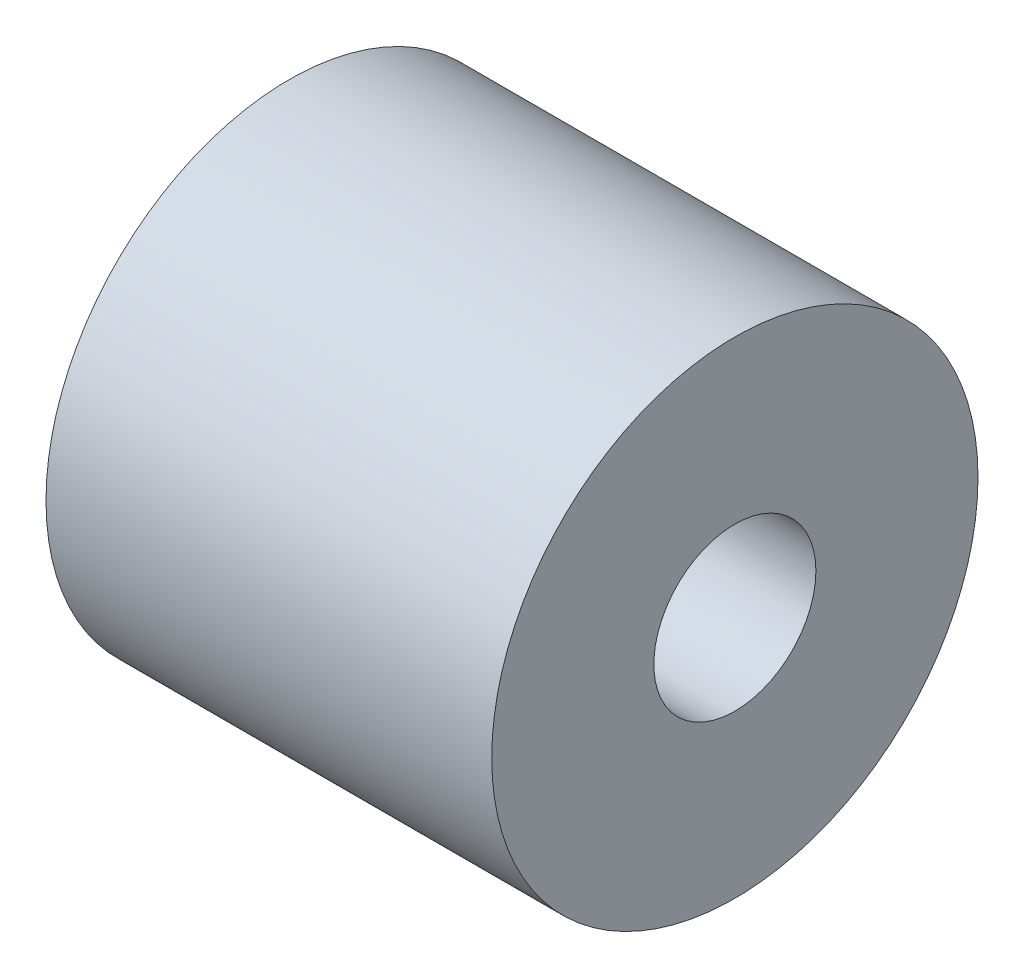
ISO-10303-21;
HEADER;
FILE_DESCRIPTION(('STEP AP214'),'2;1');
FILE_NAME('part.step','',(''),(''),'','','');
FILE_SCHEMA(('AUTOMOTIVE_DESIGN { 1 0 10303 214 1 1 1 1 }'));
ENDSEC;
DATA;
#1=APPLICATION_CONTEXT('core data for automotive mechanical design processes');
#2=APPLICATION_PROTOCOL_DEFINITION('international standard','automotive_design',2000,#1);
#3=PRODUCT_CONTEXT('',#1,'mechanical');
#4=PRODUCT('Part','Part','',(#3));
#5=PRODUCT_RELATED_PRODUCT_CATEGORY('part','',(#4));
#6=PRODUCT_DEFINITION_FORMATION('','',#4);
#7=PRODUCT_DEFINITION_CONTEXT('part definition',#1,'design');
#8=PRODUCT_DEFINITION('design','',#6,#7);
#9=PRODUCT_DEFINITION_SHAPE('','',#8);
#10=(LENGTH_UNIT() NAMED_UNIT(*) SI_UNIT(.MILLI.,.METRE.));
#11=(NAMED_UNIT(*) PLANE_ANGLE_UNIT() SI_UNIT($,.RADIAN.));
#12=(NAMED_UNIT(*) SI_UNIT($,.STERADIAN.) SOLID_ANGLE_UNIT());
#13=UNCERTAINTY_MEASURE_WITH_UNIT(LENGTH_MEASURE(1.E-05),#10,'distance_accuracy_value','');
#14=(GEOMETRIC_REPRESENTATION_CONTEXT(3) GLOBAL_UNCERTAINTY_ASSIGNED_CONTEXT((#13)) GLOBAL_UNIT_ASSIGNED_CONTEXT((#10,
#11,#12)) REPRESENTATION_CONTEXT('',''));
#15=CARTESIAN_POINT('',(0.,0.,0.));
#16=DIRECTION('',(0.,0.,1.));
#17=DIRECTION('',(1.,0.,0.));
#18=AXIS2_PLACEMENT_3D('',#15,#16,#17);
#19=CARTESIAN_POINT('',(5.5,-0.00200455213729739,-2.08425656763246));
#20=DIRECTION('',(1.,0.,0.));
#21=DIRECTION('',(0.,0.,-1.));
#22=AXIS2_PLACEMENT_3D('',#19,#20,#21);
#23=PLANE('',#22);
#24=CARTESIAN_POINT('',(5.5,-1.73477898712804E-12,-3.90798504668055E-13));
#25=DIRECTION('',(1.,0.,0.));
#26=DIRECTION('',(0.,0.,-1.));
#27=AXIS2_PLACEMENT_3D('',#24,#25,#26);
#28=CIRCLE('',#27,2.99999999999843);
#29=CARTESIAN_POINT('',(5.5,-1.73477898712804E-12,-2.99999999999883));
#30=VERTEX_POINT('',#29);
#31=EDGE_CURVE('E10',#30,#30,#28,.T.);
#32=ORIENTED_EDGE('',*,*,#31,.T.);
#33=EDGE_LOOP('',(#32));
#34=FACE_BOUND('',#33,.T.);
#35=CARTESIAN_POINT('',(5.5,-1.73477898712804E-12,-3.90798504668055E-13));
#36=DIRECTION('',(1.,0.,0.));
#37=DIRECTION('',(0.,0.,-1.));
#38=AXIS2_PLACEMENT_3D('',#35,#36,#37);
#39=CIRCLE('',#38,1.);
#40=CARTESIAN_POINT('',(5.5,-1.73477898712804E-12,-1.00000000000039));
#41=VERTEX_POINT('',#40);
#42=EDGE_CURVE('E42',#41,#41,#39,.T.);
#43=ORIENTED_EDGE('',*,*,#42,.F.);
#44=EDGE_LOOP('',(#43));
#45=FACE_BOUND('',#44,.T.);
#46=ADVANCED_FACE('F31',(#34,#45),#23,.T.);
#47=CARTESIAN_POINT('',(0.,-0.00200455213729739,-2.08425656763246));
#48=DIRECTION('',(1.,0.,0.));
#49=DIRECTION('',(0.,0.,-1.));
#50=AXIS2_PLACEMENT_3D('',#47,#48,#49);
#51=PLANE('',#50);
#52=CARTESIAN_POINT('',(0.,-1.73477898712804E-12,-3.90798504668055E-13));
#53=DIRECTION('',(1.,0.,0.));
#54=DIRECTION('',(0.,0.,-1.));
#55=AXIS2_PLACEMENT_3D('',#52,#53,#54);
#56=CIRCLE('',#55,2.99999999999897);
#57=CARTESIAN_POINT('',(0.,-1.73477898712804E-12,-2.99999999999936));
#58=VERTEX_POINT('',#57);
#59=EDGE_CURVE('E35',#58,#58,#56,.T.);
#60=ORIENTED_EDGE('',*,*,#59,.F.);
#61=EDGE_LOOP('',(#60));
#62=FACE_BOUND('',#61,.T.);
#63=CARTESIAN_POINT('',(0.,-1.73477898712804E-12,-3.90798504668055E-13));
#64=DIRECTION('',(1.,0.,0.));
#65=DIRECTION('',(0.,0.,-1.));
#66=AXIS2_PLACEMENT_3D('',#63,#64,#65);
#67=CIRCLE('',#66,1.);
#68=CARTESIAN_POINT('',(0.,-1.73477898712804E-12,-1.00000000000039));
#69=VERTEX_POINT('',#68);
#70=EDGE_CURVE('E44',#69,#69,#67,.T.);
#71=ORIENTED_EDGE('',*,*,#70,.T.);
#72=EDGE_LOOP('',(#71));
#73=FACE_BOUND('',#72,.T.);
#74=ADVANCED_FACE('F54',(#62,#73),#51,.F.);
#75=CARTESIAN_POINT('',(5.5,-1.73477898712804E-12,-3.90798504668055E-13));
#76=DIRECTION('',(-1.,0.,0.));
#77=DIRECTION('',(0.,0.,1.));
#78=AXIS2_PLACEMENT_3D('',#75,#76,#77);
#79=CYLINDRICAL_SURFACE('',#78,2.99999999999897);
#80=ORIENTED_EDGE('',*,*,#59,.T.);
#81=EDGE_LOOP('',(#80));
#82=FACE_BOUND('',#81,.T.);
#83=ORIENTED_EDGE('',*,*,#31,.F.);
#84=EDGE_LOOP('',(#83));
#85=FACE_BOUND('',#84,.T.);
#86=ADVANCED_FACE('F33',(#82,#85),#79,.T.);
#87=CARTESIAN_POINT('',(5.5,-1.73477898712804E-12,-3.90798504668055E-13));
#88=DIRECTION('',(-1.,0.,0.));
#89=DIRECTION('',(0.,0.,1.));
#90=AXIS2_PLACEMENT_3D('',#87,#88,#89);
#91=CYLINDRICAL_SURFACE('',#90,1.);
#92=ORIENTED_EDGE('',*,*,#42,.T.);
#93=EDGE_LOOP('',(#92));
#94=FACE_BOUND('',#93,.T.);
#95=ORIENTED_EDGE('',*,*,#70,.F.);
#96=EDGE_LOOP('',(#95));
#97=FACE_BOUND('',#96,.T.);
#98=ADVANCED_FACE('F50',(#94,#97),#91,.F.);
#99=CLOSED_SHELL('',(#46,#74,#86,#98));
#100=MANIFOLD_SOLID_BREP('B2',#99);
#101=ADVANCED_BREP_SHAPE_REPRESENTATION('',(#18,#100),#14);
#102=SHAPE_DEFINITION_REPRESENTATION(#9,#101);
ENDSEC;
END-ISO-10303-21;
